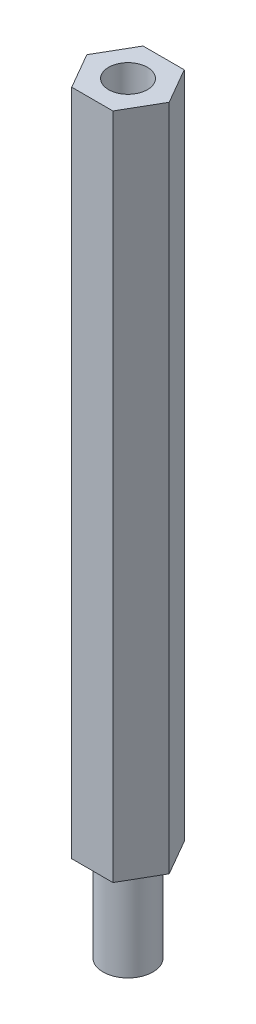
ISO-10303-21;
HEADER;
FILE_DESCRIPTION(('STEP AP214'),'2;1');
FILE_NAME('part.step','',(''),(''),'','','');
FILE_SCHEMA(('AUTOMOTIVE_DESIGN { 1 0 10303 214 1 1 1 1 }'));
ENDSEC;
DATA;
#1=APPLICATION_CONTEXT('core data for automotive mechanical design processes');
#2=APPLICATION_PROTOCOL_DEFINITION('international standard','automotive_design',2000,#1);
#3=PRODUCT_CONTEXT('',#1,'mechanical');
#4=PRODUCT('Part','Part','',(#3));
#5=PRODUCT_RELATED_PRODUCT_CATEGORY('part','',(#4));
#6=PRODUCT_DEFINITION_FORMATION('','',#4);
#7=PRODUCT_DEFINITION_CONTEXT('part definition',#1,'design');
#8=PRODUCT_DEFINITION('design','',#6,#7);
#9=PRODUCT_DEFINITION_SHAPE('','',#8);
#10=(LENGTH_UNIT() NAMED_UNIT(*) SI_UNIT(.MILLI.,.METRE.));
#11=(NAMED_UNIT(*) PLANE_ANGLE_UNIT() SI_UNIT($,.RADIAN.));
#12=(NAMED_UNIT(*) SI_UNIT($,.STERADIAN.) SOLID_ANGLE_UNIT());
#13=UNCERTAINTY_MEASURE_WITH_UNIT(LENGTH_MEASURE(1.E-05),#10,'distance_accuracy_value','');
#14=(GEOMETRIC_REPRESENTATION_CONTEXT(3) GLOBAL_UNCERTAINTY_ASSIGNED_CONTEXT((#13)) GLOBAL_UNIT_ASSIGNED_CONTEXT((#10,
#11,#12)) REPRESENTATION_CONTEXT('',''));
#15=CARTESIAN_POINT('',(0.,0.,0.));
#16=DIRECTION('',(0.,0.,1.));
#17=DIRECTION('',(1.,0.,0.));
#18=AXIS2_PLACEMENT_3D('',#15,#16,#17);
#19=CARTESIAN_POINT('',(-1.325,43.,2.29496732002876));
#20=DIRECTION('',(0.,0.,-1.));
#21=DIRECTION('',(-1.,0.,0.));
#22=AXIS2_PLACEMENT_3D('',#19,#20,#21);
#23=PLANE('',#22);
#24=DIRECTION('',(1.,0.,0.));
#25=VECTOR('',#24,1.);
#26=CARTESIAN_POINT('',(-1.325,0.,2.29496732002876));
#27=LINE('',#26,#25);
#28=CARTESIAN_POINT('',(-1.325,0.,2.29496732002876));
#29=VERTEX_POINT('',#28);
#30=CARTESIAN_POINT('',(1.325,0.,2.29496732002876));
#31=VERTEX_POINT('',#30);
#32=EDGE_CURVE('E122',#29,#31,#27,.T.);
#33=ORIENTED_EDGE('',*,*,#32,.T.);
#34=DIRECTION('',(0.,-1.,0.));
#35=VECTOR('',#34,1.);
#36=CARTESIAN_POINT('',(1.325,43.,2.29496732002876));
#37=LINE('',#36,#35);
#38=CARTESIAN_POINT('',(1.325,43.,2.29496732002876));
#39=VERTEX_POINT('',#38);
#40=EDGE_CURVE('E45',#39,#31,#37,.T.);
#41=ORIENTED_EDGE('',*,*,#40,.F.);
#42=DIRECTION('',(1.,0.,0.));
#43=VECTOR('',#42,1.);
#44=CARTESIAN_POINT('',(-1.325,43.,2.29496732002876));
#45=LINE('',#44,#43);
#46=CARTESIAN_POINT('',(-1.325,43.,2.29496732002876));
#47=VERTEX_POINT('',#46);
#48=EDGE_CURVE('E133',#47,#39,#45,.T.);
#49=ORIENTED_EDGE('',*,*,#48,.F.);
#50=DIRECTION('',(0.,-1.,0.));
#51=VECTOR('',#50,1.);
#52=CARTESIAN_POINT('',(-1.325,43.,2.29496732002876));
#53=LINE('',#52,#51);
#54=EDGE_CURVE('E118',#47,#29,#53,.T.);
#55=ORIENTED_EDGE('',*,*,#54,.T.);
#56=EDGE_LOOP('',(#33,#41,#49,#55));
#57=FACE_BOUND('',#56,.T.);
#58=ADVANCED_FACE('F37',(#57),#23,.F.);
#59=CARTESIAN_POINT('',(1.325,43.,2.29496732002876));
#60=DIRECTION('',(-0.866025403784439,0.,-0.5));
#61=DIRECTION('',(-0.5,0.,0.866025403784439));
#62=AXIS2_PLACEMENT_3D('',#59,#60,#61);
#63=PLANE('',#62);
#64=DIRECTION('',(0.5,0.,-0.866025403784439));
#65=VECTOR('',#64,1.);
#66=CARTESIAN_POINT('',(1.325,0.,2.29496732002876));
#67=LINE('',#66,#65);
#68=CARTESIAN_POINT('',(2.65,0.,0.));
#69=VERTEX_POINT('',#68);
#70=EDGE_CURVE('E125',#31,#69,#67,.T.);
#71=ORIENTED_EDGE('',*,*,#70,.T.);
#72=DIRECTION('',(0.,-1.,0.));
#73=VECTOR('',#72,1.);
#74=CARTESIAN_POINT('',(2.65,43.,0.));
#75=LINE('',#74,#73);
#76=CARTESIAN_POINT('',(2.65,43.,0.));
#77=VERTEX_POINT('',#76);
#78=EDGE_CURVE('E137',#77,#69,#75,.T.);
#79=ORIENTED_EDGE('',*,*,#78,.F.);
#80=DIRECTION('',(0.5,0.,-0.866025403784439));
#81=VECTOR('',#80,1.);
#82=CARTESIAN_POINT('',(1.325,43.,2.29496732002876));
#83=LINE('',#82,#81);
#84=EDGE_CURVE('E91',#39,#77,#83,.T.);
#85=ORIENTED_EDGE('',*,*,#84,.F.);
#86=ORIENTED_EDGE('',*,*,#40,.T.);
#87=EDGE_LOOP('',(#71,#79,#85,#86));
#88=FACE_BOUND('',#87,.T.);
#89=ADVANCED_FACE('F140',(#88),#63,.F.);
#90=CARTESIAN_POINT('',(2.65,43.,0.));
#91=DIRECTION('',(-0.866025403784439,0.,0.5));
#92=DIRECTION('',(0.5,0.,0.866025403784439));
#93=AXIS2_PLACEMENT_3D('',#90,#91,#92);
#94=PLANE('',#93);
#95=DIRECTION('',(-0.5,0.,-0.866025403784439));
#96=VECTOR('',#95,1.);
#97=CARTESIAN_POINT('',(2.65,0.,0.));
#98=LINE('',#97,#96);
#99=CARTESIAN_POINT('',(1.325,0.,-2.29496732002876));
#100=VERTEX_POINT('',#99);
#101=EDGE_CURVE('E128',#69,#100,#98,.T.);
#102=ORIENTED_EDGE('',*,*,#101,.T.);
#103=DIRECTION('',(0.,-1.,0.));
#104=VECTOR('',#103,1.);
#105=CARTESIAN_POINT('',(1.325,43.,-2.29496732002876));
#106=LINE('',#105,#104);
#107=CARTESIAN_POINT('',(1.325,43.,-2.29496732002876));
#108=VERTEX_POINT('',#107);
#109=EDGE_CURVE('E113',#108,#100,#106,.T.);
#110=ORIENTED_EDGE('',*,*,#109,.F.);
#111=DIRECTION('',(-0.5,0.,-0.866025403784439));
#112=VECTOR('',#111,1.);
#113=CARTESIAN_POINT('',(2.65,43.,0.));
#114=LINE('',#113,#112);
#115=EDGE_CURVE('E104',#77,#108,#114,.T.);
#116=ORIENTED_EDGE('',*,*,#115,.F.);
#117=ORIENTED_EDGE('',*,*,#78,.T.);
#118=EDGE_LOOP('',(#102,#110,#116,#117));
#119=FACE_BOUND('',#118,.T.);
#120=ADVANCED_FACE('F148',(#119),#94,.F.);
#121=CARTESIAN_POINT('',(1.325,43.,-2.29496732002876));
#122=DIRECTION('',(0.,0.,1.));
#123=DIRECTION('',(1.,0.,0.));
#124=AXIS2_PLACEMENT_3D('',#121,#122,#123);
#125=PLANE('',#124);
#126=DIRECTION('',(-1.,0.,0.));
#127=VECTOR('',#126,1.);
#128=CARTESIAN_POINT('',(1.325,0.,-2.29496732002876));
#129=LINE('',#128,#127);
#130=CARTESIAN_POINT('',(-1.325,0.,-2.29496732002876));
#131=VERTEX_POINT('',#130);
#132=EDGE_CURVE('E112',#100,#131,#129,.T.);
#133=ORIENTED_EDGE('',*,*,#132,.T.);
#134=DIRECTION('',(0.,-1.,0.));
#135=VECTOR('',#134,1.);
#136=CARTESIAN_POINT('',(-1.325,43.,-2.29496732002876));
#137=LINE('',#136,#135);
#138=CARTESIAN_POINT('',(-1.325,43.,-2.29496732002876));
#139=VERTEX_POINT('',#138);
#140=EDGE_CURVE('E109',#139,#131,#137,.T.);
#141=ORIENTED_EDGE('',*,*,#140,.F.);
#142=DIRECTION('',(-1.,0.,0.));
#143=VECTOR('',#142,1.);
#144=CARTESIAN_POINT('',(1.325,43.,-2.29496732002876));
#145=LINE('',#144,#143);
#146=EDGE_CURVE('E98',#108,#139,#145,.T.);
#147=ORIENTED_EDGE('',*,*,#146,.F.);
#148=ORIENTED_EDGE('',*,*,#109,.T.);
#149=EDGE_LOOP('',(#133,#141,#147,#148));
#150=FACE_BOUND('',#149,.T.);
#151=ADVANCED_FACE('F110',(#150),#125,.F.);
#152=CARTESIAN_POINT('',(-1.325,43.,-2.29496732002876));
#153=DIRECTION('',(0.866025403784439,0.,0.5));
#154=DIRECTION('',(0.5,0.,-0.866025403784439));
#155=AXIS2_PLACEMENT_3D('',#152,#153,#154);
#156=PLANE('',#155);
#157=DIRECTION('',(-0.5,0.,0.866025403784439));
#158=VECTOR('',#157,1.);
#159=CARTESIAN_POINT('',(-1.325,0.,-2.29496732002876));
#160=LINE('',#159,#158);
#161=CARTESIAN_POINT('',(-2.65,0.,0.));
#162=VERTEX_POINT('',#161);
#163=EDGE_CURVE('E76',#131,#162,#160,.T.);
#164=ORIENTED_EDGE('',*,*,#163,.T.);
#165=DIRECTION('',(0.,-1.,0.));
#166=VECTOR('',#165,1.);
#167=CARTESIAN_POINT('',(-2.65,43.,0.));
#168=LINE('',#167,#166);
#169=CARTESIAN_POINT('',(-2.65,43.,0.));
#170=VERTEX_POINT('',#169);
#171=EDGE_CURVE('E114',#170,#162,#168,.T.);
#172=ORIENTED_EDGE('',*,*,#171,.F.);
#173=DIRECTION('',(-0.5,0.,0.866025403784439));
#174=VECTOR('',#173,1.);
#175=CARTESIAN_POINT('',(-1.325,43.,-2.29496732002876));
#176=LINE('',#175,#174);
#177=EDGE_CURVE('E102',#139,#170,#176,.T.);
#178=ORIENTED_EDGE('',*,*,#177,.F.);
#179=ORIENTED_EDGE('',*,*,#140,.T.);
#180=EDGE_LOOP('',(#164,#172,#178,#179));
#181=FACE_BOUND('',#180,.T.);
#182=ADVANCED_FACE('F116',(#181),#156,.F.);
#183=CARTESIAN_POINT('',(-2.65,43.,0.));
#184=DIRECTION('',(0.866025403784439,0.,-0.5));
#185=DIRECTION('',(-0.5,0.,-0.866025403784439));
#186=AXIS2_PLACEMENT_3D('',#183,#184,#185);
#187=PLANE('',#186);
#188=DIRECTION('',(0.5,0.,0.866025403784439));
#189=VECTOR('',#188,1.);
#190=CARTESIAN_POINT('',(-2.65,0.,0.));
#191=LINE('',#190,#189);
#192=EDGE_CURVE('E82',#162,#29,#191,.T.);
#193=ORIENTED_EDGE('',*,*,#192,.T.);
#194=ORIENTED_EDGE('',*,*,#54,.F.);
#195=DIRECTION('',(0.5,0.,0.866025403784439));
#196=VECTOR('',#195,1.);
#197=CARTESIAN_POINT('',(-2.65,43.,0.));
#198=LINE('',#197,#196);
#199=EDGE_CURVE('E53',#170,#47,#198,.T.);
#200=ORIENTED_EDGE('',*,*,#199,.F.);
#201=ORIENTED_EDGE('',*,*,#171,.T.);
#202=EDGE_LOOP('',(#193,#194,#200,#201));
#203=FACE_BOUND('',#202,.T.);
#204=ADVANCED_FACE('F171',(#203),#187,.F.);
#205=CARTESIAN_POINT('',(0.,43.,0.));
#206=DIRECTION('',(0.,1.,0.));
#207=DIRECTION('',(0.,0.,1.));
#208=AXIS2_PLACEMENT_3D('',#205,#206,#207);
#209=PLANE('',#208);
#210=CARTESIAN_POINT('',(0.,43.,0.));
#211=DIRECTION('',(0.,1.,0.));
#212=DIRECTION('',(0.,0.,1.));
#213=AXIS2_PLACEMENT_3D('',#210,#211,#212);
#214=CIRCLE('',#213,1.25);
#215=CARTESIAN_POINT('',(0.,43.,1.25));
#216=VERTEX_POINT('',#215);
#217=EDGE_CURVE('E155',#216,#216,#214,.T.);
#218=ORIENTED_EDGE('',*,*,#217,.F.);
#219=EDGE_LOOP('',(#218));
#220=FACE_BOUND('',#219,.T.);
#221=ORIENTED_EDGE('',*,*,#48,.T.);
#222=ORIENTED_EDGE('',*,*,#84,.T.);
#223=ORIENTED_EDGE('',*,*,#115,.T.);
#224=ORIENTED_EDGE('',*,*,#146,.T.);
#225=ORIENTED_EDGE('',*,*,#177,.T.);
#226=ORIENTED_EDGE('',*,*,#199,.T.);
#227=EDGE_LOOP('',(#221,#222,#223,#224,#225,#226));
#228=FACE_BOUND('',#227,.T.);
#229=ADVANCED_FACE('F100',(#220,#228),#209,.T.);
#230=CARTESIAN_POINT('',(0.,0.,0.));
#231=DIRECTION('',(0.,1.,0.));
#232=DIRECTION('',(0.,0.,1.));
#233=AXIS2_PLACEMENT_3D('',#230,#231,#232);
#234=PLANE('',#233);
#235=CARTESIAN_POINT('',(0.,0.,0.));
#236=DIRECTION('',(0.,1.,0.));
#237=DIRECTION('',(0.,0.,1.));
#238=AXIS2_PLACEMENT_3D('',#235,#236,#237);
#239=CIRCLE('',#238,1.6);
#240=CARTESIAN_POINT('',(0.,0.,1.6));
#241=VERTEX_POINT('',#240);
#242=EDGE_CURVE('E11',#241,#241,#239,.F.);
#243=ORIENTED_EDGE('',*,*,#242,.F.);
#244=EDGE_LOOP('',(#243));
#245=FACE_BOUND('',#244,.T.);
#246=ORIENTED_EDGE('',*,*,#32,.F.);
#247=ORIENTED_EDGE('',*,*,#192,.F.);
#248=ORIENTED_EDGE('',*,*,#163,.F.);
#249=ORIENTED_EDGE('',*,*,#132,.F.);
#250=ORIENTED_EDGE('',*,*,#101,.F.);
#251=ORIENTED_EDGE('',*,*,#70,.F.);
#252=EDGE_LOOP('',(#246,#247,#248,#249,#250,#251));
#253=FACE_BOUND('',#252,.T.);
#254=ADVANCED_FACE('F145',(#245,#253),#234,.F.);
#255=CARTESIAN_POINT('',(0.,-6.,0.));
#256=DIRECTION('',(0.,1.,0.));
#257=DIRECTION('',(0.,0.,1.));
#258=AXIS2_PLACEMENT_3D('',#255,#256,#257);
#259=CYLINDRICAL_SURFACE('',#258,1.6);
#260=CARTESIAN_POINT('',(0.,-6.,0.));
#261=DIRECTION('',(0.,-1.,0.));
#262=DIRECTION('',(0.,0.,-1.));
#263=AXIS2_PLACEMENT_3D('',#260,#261,#262);
#264=CIRCLE('',#263,1.6);
#265=CARTESIAN_POINT('',(0.,-6.,-1.6));
#266=VERTEX_POINT('',#265);
#267=EDGE_CURVE('E126',#266,#266,#264,.T.);
#268=ORIENTED_EDGE('',*,*,#267,.F.);
#269=EDGE_LOOP('',(#268));
#270=FACE_BOUND('',#269,.T.);
#271=ORIENTED_EDGE('',*,*,#242,.T.);
#272=EDGE_LOOP('',(#271));
#273=FACE_BOUND('',#272,.T.);
#274=ADVANCED_FACE('F177',(#270,#273),#259,.T.);
#275=CARTESIAN_POINT('',(0.,-6.,0.));
#276=DIRECTION('',(0.,-1.,0.));
#277=DIRECTION('',(0.,0.,-1.));
#278=AXIS2_PLACEMENT_3D('',#275,#276,#277);
#279=PLANE('',#278);
#280=ORIENTED_EDGE('',*,*,#267,.T.);
#281=EDGE_LOOP('',(#280));
#282=FACE_BOUND('',#281,.T.);
#283=ADVANCED_FACE('F166',(#282),#279,.T.);
#284=CARTESIAN_POINT('',(0.,38.,0.));
#285=DIRECTION('',(0.,1.,0.));
#286=DIRECTION('',(0.,0.,1.));
#287=AXIS2_PLACEMENT_3D('',#284,#285,#286);
#288=CYLINDRICAL_SURFACE('',#287,1.25);
#289=CARTESIAN_POINT('',(0.,38.,0.));
#290=DIRECTION('',(0.,1.,0.));
#291=DIRECTION('',(0.,0.,1.));
#292=AXIS2_PLACEMENT_3D('',#289,#290,#291);
#293=CIRCLE('',#292,1.25);
#294=CARTESIAN_POINT('',(0.,38.,1.25));
#295=VERTEX_POINT('',#294);
#296=EDGE_CURVE('E154',#295,#295,#293,.T.);
#297=ORIENTED_EDGE('',*,*,#296,.F.);
#298=EDGE_LOOP('',(#297));
#299=FACE_BOUND('',#298,.T.);
#300=ORIENTED_EDGE('',*,*,#217,.T.);
#301=EDGE_LOOP('',(#300));
#302=FACE_BOUND('',#301,.T.);
#303=ADVANCED_FACE('F163',(#299,#302),#288,.F.);
#304=CARTESIAN_POINT('',(0.,38.,0.));
#305=DIRECTION('',(0.,1.,0.));
#306=DIRECTION('',(0.,0.,1.));
#307=AXIS2_PLACEMENT_3D('',#304,#305,#306);
#308=PLANE('',#307);
#309=ORIENTED_EDGE('',*,*,#296,.T.);
#310=EDGE_LOOP('',(#309));
#311=FACE_BOUND('',#310,.T.);
#312=ADVANCED_FACE('F161',(#311),#308,.T.);
#313=CLOSED_SHELL('',(#58,#89,#120,#151,#182,#204,#229,#254,#274,#283,#303,#312));
#314=MANIFOLD_SOLID_BREP('B2',#313);
#315=ADVANCED_BREP_SHAPE_REPRESENTATION('',(#18,#314),#14);
#316=SHAPE_DEFINITION_REPRESENTATION(#9,#315);
ENDSEC;
END-ISO-10303-21;
